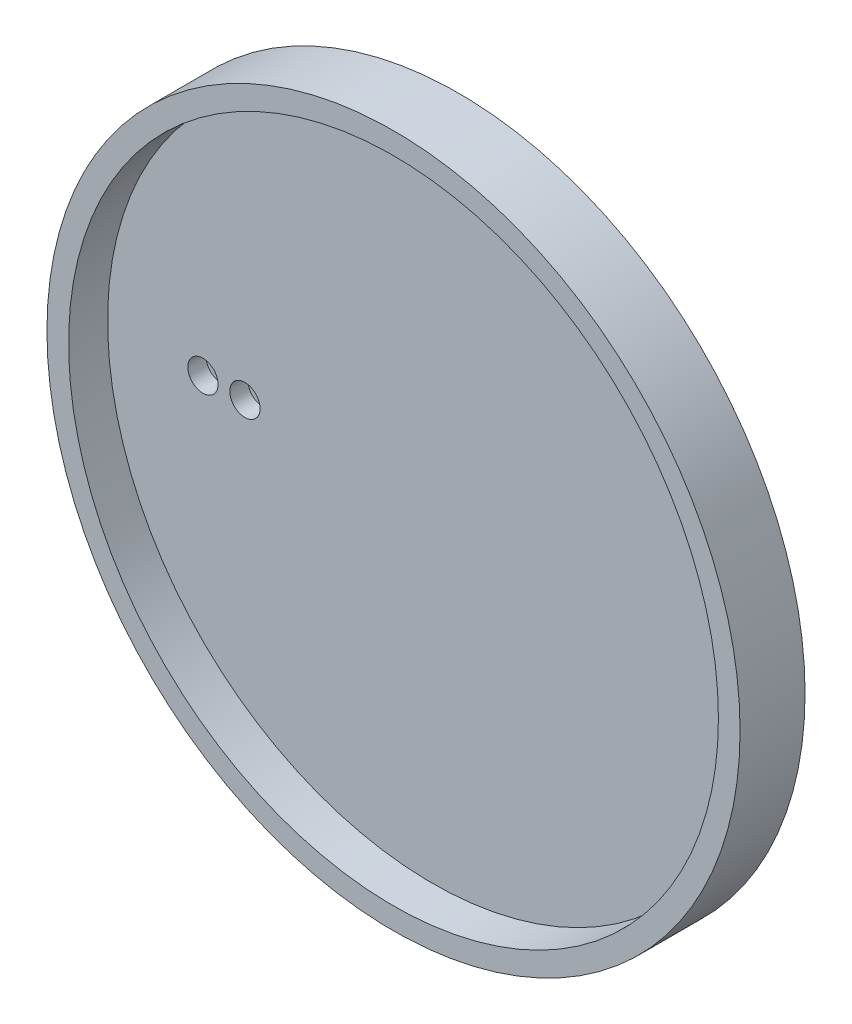
ISO-10303-21;
HEADER;
FILE_DESCRIPTION(('STEP AP214'),'2;1');
FILE_NAME('part.step','',(''),(''),'','','');
FILE_SCHEMA(('AUTOMOTIVE_DESIGN { 1 0 10303 214 1 1 1 1 }'));
ENDSEC;
DATA;
#1=APPLICATION_CONTEXT('core data for automotive mechanical design processes');
#2=APPLICATION_PROTOCOL_DEFINITION('international standard','automotive_design',2000,#1);
#3=PRODUCT_CONTEXT('',#1,'mechanical');
#4=PRODUCT('Part','Part','',(#3));
#5=PRODUCT_RELATED_PRODUCT_CATEGORY('part','',(#4));
#6=PRODUCT_DEFINITION_FORMATION('','',#4);
#7=PRODUCT_DEFINITION_CONTEXT('part definition',#1,'design');
#8=PRODUCT_DEFINITION('design','',#6,#7);
#9=PRODUCT_DEFINITION_SHAPE('','',#8);
#10=(LENGTH_UNIT() NAMED_UNIT(*) SI_UNIT(.MILLI.,.METRE.));
#11=(NAMED_UNIT(*) PLANE_ANGLE_UNIT() SI_UNIT($,.RADIAN.));
#12=(NAMED_UNIT(*) SI_UNIT($,.STERADIAN.) SOLID_ANGLE_UNIT());
#13=UNCERTAINTY_MEASURE_WITH_UNIT(LENGTH_MEASURE(1.E-05),#10,'distance_accuracy_value','');
#14=(GEOMETRIC_REPRESENTATION_CONTEXT(3) GLOBAL_UNCERTAINTY_ASSIGNED_CONTEXT((#13)) GLOBAL_UNIT_ASSIGNED_CONTEXT((#10,
#11,#12)) REPRESENTATION_CONTEXT('',''));
#15=CARTESIAN_POINT('',(0.,0.,0.));
#16=DIRECTION('',(0.,0.,1.));
#17=DIRECTION('',(1.,0.,0.));
#18=AXIS2_PLACEMENT_3D('',#15,#16,#17);
#19=CARTESIAN_POINT('',(-52.9937969924812,6.35,2.7));
#20=DIRECTION('',(0.,0.,-1.));
#21=DIRECTION('',(-1.,0.,0.));
#22=AXIS2_PLACEMENT_3D('',#19,#20,#21);
#23=CYLINDRICAL_SURFACE('',#22,2.04999999999999);
#24=CARTESIAN_POINT('',(-52.9937969924812,6.35,-10.));
#25=DIRECTION('',(0.,0.,-1.));
#26=DIRECTION('',(-1.,0.,0.));
#27=AXIS2_PLACEMENT_3D('',#24,#25,#26);
#28=CIRCLE('',#27,2.04999999999999);
#29=CARTESIAN_POINT('',(-55.0437969924812,6.35,-10.));
#30=VERTEX_POINT('',#29);
#31=EDGE_CURVE('E167',#30,#30,#28,.T.);
#32=ORIENTED_EDGE('',*,*,#31,.T.);
#33=EDGE_LOOP('',(#32));
#34=FACE_BOUND('',#33,.T.);
#35=CARTESIAN_POINT('',(-52.9937969924812,6.35,1.8));
#36=DIRECTION('',(0.,0.,1.));
#37=DIRECTION('',(1.,0.,0.));
#38=AXIS2_PLACEMENT_3D('',#35,#36,#37);
#39=CIRCLE('',#38,2.04999999999999);
#40=CARTESIAN_POINT('',(-50.9437969924812,6.35,1.8));
#41=VERTEX_POINT('',#40);
#42=EDGE_CURVE('E39',#41,#41,#39,.F.);
#43=ORIENTED_EDGE('',*,*,#42,.F.);
#44=EDGE_LOOP('',(#43));
#45=FACE_BOUND('',#44,.T.);
#46=ADVANCED_FACE('F35',(#34,#45),#23,.F.);
#47=CARTESIAN_POINT('',(-43.2937969924812,6.35,2.7));
#48=DIRECTION('',(0.,0.,-1.));
#49=DIRECTION('',(-1.,0.,0.));
#50=AXIS2_PLACEMENT_3D('',#47,#48,#49);
#51=CYLINDRICAL_SURFACE('',#50,2.04999999999999);
#52=CARTESIAN_POINT('',(-43.2937969924812,6.35,-10.));
#53=DIRECTION('',(0.,0.,-1.));
#54=DIRECTION('',(-1.,0.,0.));
#55=AXIS2_PLACEMENT_3D('',#52,#53,#54);
#56=CIRCLE('',#55,2.04999999999999);
#57=CARTESIAN_POINT('',(-45.3437969924812,6.35,-10.));
#58=VERTEX_POINT('',#57);
#59=EDGE_CURVE('E124',#58,#58,#56,.T.);
#60=ORIENTED_EDGE('',*,*,#59,.T.);
#61=EDGE_LOOP('',(#60));
#62=FACE_BOUND('',#61,.T.);
#63=CARTESIAN_POINT('',(-43.2937969924812,6.35,1.8));
#64=DIRECTION('',(0.,0.,1.));
#65=DIRECTION('',(1.,0.,0.));
#66=AXIS2_PLACEMENT_3D('',#63,#64,#65);
#67=CIRCLE('',#66,2.04999999999999);
#68=CARTESIAN_POINT('',(-41.2437969924812,6.35,1.8));
#69=VERTEX_POINT('',#68);
#70=EDGE_CURVE('E135',#69,#69,#67,.F.);
#71=ORIENTED_EDGE('',*,*,#70,.F.);
#72=EDGE_LOOP('',(#71));
#73=FACE_BOUND('',#72,.T.);
#74=ADVANCED_FACE('F203',(#62,#73),#51,.F.);
#75=CARTESIAN_POINT('',(-58.5761278195489,12.7,0.));
#76=DIRECTION('',(1.,0.,0.));
#77=DIRECTION('',(0.,0.,-1.));
#78=AXIS2_PLACEMENT_3D('',#75,#76,#77);
#79=PLANE('',#78);
#80=DIRECTION('',(0.,0.,1.));
#81=VECTOR('',#80,1.);
#82=CARTESIAN_POINT('',(-58.5761278195489,0.,0.));
#83=LINE('',#82,#81);
#84=CARTESIAN_POINT('',(-58.5761278195489,0.,-10.));
#85=VERTEX_POINT('',#84);
#86=CARTESIAN_POINT('',(-58.5761278195489,0.,0.));
#87=VERTEX_POINT('',#86);
#88=EDGE_CURVE('E120',#85,#87,#83,.T.);
#89=ORIENTED_EDGE('',*,*,#88,.T.);
#90=DIRECTION('',(0.,-1.,0.));
#91=VECTOR('',#90,1.);
#92=CARTESIAN_POINT('',(-58.5761278195489,12.7,0.));
#93=LINE('',#92,#91);
#94=CARTESIAN_POINT('',(-58.5761278195489,12.7,0.));
#95=VERTEX_POINT('',#94);
#96=EDGE_CURVE('E11',#95,#87,#93,.T.);
#97=ORIENTED_EDGE('',*,*,#96,.F.);
#98=DIRECTION('',(0.,0.,1.));
#99=VECTOR('',#98,1.);
#100=CARTESIAN_POINT('',(-58.5761278195489,12.7,0.));
#101=LINE('',#100,#99);
#102=CARTESIAN_POINT('',(-58.5761278195489,12.7,-10.));
#103=VERTEX_POINT('',#102);
#104=EDGE_CURVE('E87',#103,#95,#101,.T.);
#105=ORIENTED_EDGE('',*,*,#104,.F.);
#106=DIRECTION('',(0.,-1.,0.));
#107=VECTOR('',#106,1.);
#108=CARTESIAN_POINT('',(-58.5761278195489,12.7,-10.));
#109=LINE('',#108,#107);
#110=EDGE_CURVE('E116',#103,#85,#109,.T.);
#111=ORIENTED_EDGE('',*,*,#110,.T.);
#112=EDGE_LOOP('',(#89,#97,#105,#111));
#113=FACE_BOUND('',#112,.T.);
#114=ADVANCED_FACE('F37',(#113),#79,.F.);
#115=CARTESIAN_POINT('',(16.4238721804511,12.7,0.));
#116=DIRECTION('',(-1.,0.,0.));
#117=DIRECTION('',(0.,0.,1.));
#118=AXIS2_PLACEMENT_3D('',#115,#116,#117);
#119=PLANE('',#118);
#120=DIRECTION('',(0.,0.,-1.));
#121=VECTOR('',#120,1.);
#122=CARTESIAN_POINT('',(16.4238721804511,0.,0.));
#123=LINE('',#122,#121);
#124=CARTESIAN_POINT('',(16.4238721804511,0.,0.));
#125=VERTEX_POINT('',#124);
#126=CARTESIAN_POINT('',(16.4238721804511,0.,-5.));
#127=VERTEX_POINT('',#126);
#128=EDGE_CURVE('E127',#125,#127,#123,.T.);
#129=ORIENTED_EDGE('',*,*,#128,.T.);
#130=DIRECTION('',(0.,-1.,0.));
#131=VECTOR('',#130,1.);
#132=CARTESIAN_POINT('',(16.4238721804511,12.7,-5.));
#133=LINE('',#132,#131);
#134=CARTESIAN_POINT('',(16.4238721804511,12.7,-5.));
#135=VERTEX_POINT('',#134);
#136=EDGE_CURVE('E111',#135,#127,#133,.T.);
#137=ORIENTED_EDGE('',*,*,#136,.F.);
#138=DIRECTION('',(0.,0.,-1.));
#139=VECTOR('',#138,1.);
#140=CARTESIAN_POINT('',(16.4238721804511,12.7,0.));
#141=LINE('',#140,#139);
#142=CARTESIAN_POINT('',(16.4238721804511,12.7,0.));
#143=VERTEX_POINT('',#142);
#144=EDGE_CURVE('E102',#143,#135,#141,.T.);
#145=ORIENTED_EDGE('',*,*,#144,.F.);
#146=DIRECTION('',(0.,-1.,0.));
#147=VECTOR('',#146,1.);
#148=CARTESIAN_POINT('',(16.4238721804511,12.7,0.));
#149=LINE('',#148,#147);
#150=EDGE_CURVE('E45',#143,#125,#149,.T.);
#151=ORIENTED_EDGE('',*,*,#150,.T.);
#152=EDGE_LOOP('',(#129,#137,#145,#151));
#153=FACE_BOUND('',#152,.T.);
#154=ADVANCED_FACE('F178',(#153),#119,.F.);
#155=CARTESIAN_POINT('',(16.4238721804511,12.7,-5.));
#156=DIRECTION('',(0.,0.,1.));
#157=DIRECTION('',(1.,0.,0.));
#158=AXIS2_PLACEMENT_3D('',#155,#156,#157);
#159=PLANE('',#158);
#160=DIRECTION('',(-1.,0.,0.));
#161=VECTOR('',#160,1.);
#162=CARTESIAN_POINT('',(16.4238721804511,0.,-5.));
#163=LINE('',#162,#161);
#164=CARTESIAN_POINT('',(-37.7114661654135,0.,-4.99999999999999));
#165=VERTEX_POINT('',#164);
#166=EDGE_CURVE('E110',#127,#165,#163,.T.);
#167=ORIENTED_EDGE('',*,*,#166,.T.);
#168=DIRECTION('',(0.,-1.,0.));
#169=VECTOR('',#168,1.);
#170=CARTESIAN_POINT('',(-37.7114661654135,12.7,-4.99999999999999));
#171=LINE('',#170,#169);
#172=CARTESIAN_POINT('',(-37.7114661654135,12.7,-4.99999999999999));
#173=VERTEX_POINT('',#172);
#174=EDGE_CURVE('E107',#173,#165,#171,.T.);
#175=ORIENTED_EDGE('',*,*,#174,.F.);
#176=DIRECTION('',(-1.,0.,0.));
#177=VECTOR('',#176,1.);
#178=CARTESIAN_POINT('',(16.4238721804511,12.7,-5.));
#179=LINE('',#178,#177);
#180=EDGE_CURVE('E96',#135,#173,#179,.T.);
#181=ORIENTED_EDGE('',*,*,#180,.F.);
#182=ORIENTED_EDGE('',*,*,#136,.T.);
#183=EDGE_LOOP('',(#167,#175,#181,#182));
#184=FACE_BOUND('',#183,.T.);
#185=ADVANCED_FACE('F108',(#184),#159,.F.);
#186=CARTESIAN_POINT('',(-37.7114661654135,12.7,-4.99999999999999));
#187=DIRECTION('',(-1.,0.,0.));
#188=DIRECTION('',(0.,0.,1.));
#189=AXIS2_PLACEMENT_3D('',#186,#187,#188);
#190=PLANE('',#189);
#191=DIRECTION('',(0.,0.,-1.));
#192=VECTOR('',#191,1.);
#193=CARTESIAN_POINT('',(-37.7114661654135,0.,-4.99999999999999));
#194=LINE('',#193,#192);
#195=CARTESIAN_POINT('',(-37.7114661654135,0.,-10.));
#196=VERTEX_POINT('',#195);
#197=EDGE_CURVE('E75',#165,#196,#194,.T.);
#198=ORIENTED_EDGE('',*,*,#197,.T.);
#199=DIRECTION('',(0.,-1.,0.));
#200=VECTOR('',#199,1.);
#201=CARTESIAN_POINT('',(-37.7114661654135,12.7,-10.));
#202=LINE('',#201,#200);
#203=CARTESIAN_POINT('',(-37.7114661654135,12.7,-10.));
#204=VERTEX_POINT('',#203);
#205=EDGE_CURVE('E112',#204,#196,#202,.T.);
#206=ORIENTED_EDGE('',*,*,#205,.F.);
#207=DIRECTION('',(0.,0.,-1.));
#208=VECTOR('',#207,1.);
#209=CARTESIAN_POINT('',(-37.7114661654135,12.7,-4.99999999999999));
#210=LINE('',#209,#208);
#211=EDGE_CURVE('E100',#173,#204,#210,.T.);
#212=ORIENTED_EDGE('',*,*,#211,.F.);
#213=ORIENTED_EDGE('',*,*,#174,.T.);
#214=EDGE_LOOP('',(#198,#206,#212,#213));
#215=FACE_BOUND('',#214,.T.);
#216=ADVANCED_FACE('F114',(#215),#190,.F.);
#217=CARTESIAN_POINT('',(-58.5761278195489,12.7,-10.));
#218=DIRECTION('',(0.,0.,1.));
#219=DIRECTION('',(1.,0.,0.));
#220=AXIS2_PLACEMENT_3D('',#217,#218,#219);
#221=PLANE('',#220);
#222=ORIENTED_EDGE('',*,*,#59,.F.);
#223=EDGE_LOOP('',(#222));
#224=FACE_BOUND('',#223,.T.);
#225=ORIENTED_EDGE('',*,*,#31,.F.);
#226=EDGE_LOOP('',(#225));
#227=FACE_BOUND('',#226,.T.);
#228=DIRECTION('',(-1.,0.,0.));
#229=VECTOR('',#228,1.);
#230=CARTESIAN_POINT('',(-58.5761278195489,0.,-10.));
#231=LINE('',#230,#229);
#232=EDGE_CURVE('E81',#196,#85,#231,.T.);
#233=ORIENTED_EDGE('',*,*,#232,.T.);
#234=ORIENTED_EDGE('',*,*,#110,.F.);
#235=DIRECTION('',(-1.,0.,0.));
#236=VECTOR('',#235,1.);
#237=CARTESIAN_POINT('',(-58.5761278195489,12.7,-10.));
#238=LINE('',#237,#236);
#239=EDGE_CURVE('E54',#204,#103,#238,.T.);
#240=ORIENTED_EDGE('',*,*,#239,.F.);
#241=ORIENTED_EDGE('',*,*,#205,.T.);
#242=EDGE_LOOP('',(#233,#234,#240,#241));
#243=FACE_BOUND('',#242,.T.);
#244=ADVANCED_FACE('F187',(#224,#227,#243),#221,.F.);
#245=CARTESIAN_POINT('',(0.,12.7,0.));
#246=DIRECTION('',(0.,-1.,0.));
#247=DIRECTION('',(0.,0.,-1.));
#248=AXIS2_PLACEMENT_3D('',#245,#246,#247);
#249=PLANE('',#248);
#250=ORIENTED_EDGE('',*,*,#104,.T.);
#251=DIRECTION('',(1.,0.,0.));
#252=VECTOR('',#251,1.);
#253=CARTESIAN_POINT('',(-58.5761278195489,12.7,0.));
#254=LINE('',#253,#252);
#255=EDGE_CURVE('E173',#95,#143,#254,.T.);
#256=ORIENTED_EDGE('',*,*,#255,.T.);
#257=ORIENTED_EDGE('',*,*,#144,.T.);
#258=ORIENTED_EDGE('',*,*,#180,.T.);
#259=ORIENTED_EDGE('',*,*,#211,.T.);
#260=ORIENTED_EDGE('',*,*,#239,.T.);
#261=EDGE_LOOP('',(#250,#256,#257,#258,#259,#260));
#262=FACE_BOUND('',#261,.T.);
#263=ADVANCED_FACE('F98',(#262),#249,.F.);
#264=CARTESIAN_POINT('',(0.,0.,0.));
#265=DIRECTION('',(0.,-1.,0.));
#266=DIRECTION('',(0.,0.,-1.));
#267=AXIS2_PLACEMENT_3D('',#264,#265,#266);
#268=PLANE('',#267);
#269=ORIENTED_EDGE('',*,*,#88,.F.);
#270=ORIENTED_EDGE('',*,*,#232,.F.);
#271=ORIENTED_EDGE('',*,*,#197,.F.);
#272=ORIENTED_EDGE('',*,*,#166,.F.);
#273=ORIENTED_EDGE('',*,*,#128,.F.);
#274=DIRECTION('',(1.,0.,0.));
#275=VECTOR('',#274,1.);
#276=CARTESIAN_POINT('',(-58.5761278195489,0.,0.));
#277=LINE('',#276,#275);
#278=EDGE_CURVE('E123',#87,#125,#277,.T.);
#279=ORIENTED_EDGE('',*,*,#278,.F.);
#280=EDGE_LOOP('',(#269,#270,#271,#272,#273,#279));
#281=FACE_BOUND('',#280,.T.);
#282=ADVANCED_FACE('F185',(#281),#268,.T.);
#283=CARTESIAN_POINT('',(0.,0.,0.));
#284=DIRECTION('',(0.,0.,1.));
#285=DIRECTION('',(1.,0.,0.));
#286=AXIS2_PLACEMENT_3D('',#283,#284,#285);
#287=PLANE('',#286);
#288=ORIENTED_EDGE('',*,*,#96,.T.);
#289=ORIENTED_EDGE('',*,*,#278,.T.);
#290=ORIENTED_EDGE('',*,*,#150,.F.);
#291=ORIENTED_EDGE('',*,*,#255,.F.);
#292=EDGE_LOOP('',(#288,#289,#290,#291));
#293=FACE_BOUND('',#292,.T.);
#294=CARTESIAN_POINT('',(0.,6.35,0.));
#295=DIRECTION('',(0.,0.,1.));
#296=DIRECTION('',(1.,0.,0.));
#297=AXIS2_PLACEMENT_3D('',#294,#295,#296);
#298=CIRCLE('',#297,80.);
#299=CARTESIAN_POINT('',(80.,6.35,0.));
#300=VERTEX_POINT('',#299);
#301=EDGE_CURVE('E141',#300,#300,#298,.T.);
#302=ORIENTED_EDGE('',*,*,#301,.F.);
#303=EDGE_LOOP('',(#302));
#304=FACE_BOUND('',#303,.T.);
#305=ADVANCED_FACE('F180',(#293,#304),#287,.F.);
#306=CARTESIAN_POINT('',(0.,0.,6.));
#307=DIRECTION('',(0.,0.,1.));
#308=DIRECTION('',(1.,0.,0.));
#309=AXIS2_PLACEMENT_3D('',#306,#307,#308);
#310=PLANE('',#309);
#311=CARTESIAN_POINT('',(-52.9937969924812,6.35,6.));
#312=DIRECTION('',(0.,0.,1.));
#313=DIRECTION('',(1.,0.,0.));
#314=AXIS2_PLACEMENT_3D('',#311,#312,#313);
#315=CIRCLE('',#314,3.5);
#316=CARTESIAN_POINT('',(-49.4937969924812,6.35,6.));
#317=VERTEX_POINT('',#316);
#318=EDGE_CURVE('E143',#317,#317,#315,.T.);
#319=ORIENTED_EDGE('',*,*,#318,.F.);
#320=EDGE_LOOP('',(#319));
#321=FACE_BOUND('',#320,.T.);
#322=CARTESIAN_POINT('',(-43.2937969924812,6.35,6.));
#323=DIRECTION('',(0.,0.,1.));
#324=DIRECTION('',(1.,0.,0.));
#325=AXIS2_PLACEMENT_3D('',#322,#323,#324);
#326=CIRCLE('',#325,3.5);
#327=CARTESIAN_POINT('',(-39.7937969924812,6.35,6.));
#328=VERTEX_POINT('',#327);
#329=EDGE_CURVE('E153',#328,#328,#326,.T.);
#330=ORIENTED_EDGE('',*,*,#329,.F.);
#331=EDGE_LOOP('',(#330));
#332=FACE_BOUND('',#331,.T.);
#333=CARTESIAN_POINT('',(0.,6.35,6.));
#334=DIRECTION('',(0.,0.,1.));
#335=DIRECTION('',(1.,0.,0.));
#336=AXIS2_PLACEMENT_3D('',#333,#334,#335);
#337=CIRCLE('',#336,75.);
#338=CARTESIAN_POINT('',(75.,6.35,6.));
#339=VERTEX_POINT('',#338);
#340=EDGE_CURVE('E162',#339,#339,#337,.F.);
#341=ORIENTED_EDGE('',*,*,#340,.F.);
#342=EDGE_LOOP('',(#341));
#343=FACE_BOUND('',#342,.T.);
#344=ADVANCED_FACE('F218',(#321,#332,#343),#310,.T.);
#345=CARTESIAN_POINT('',(0.,6.35,15.));
#346=DIRECTION('',(0.,0.,-1.));
#347=DIRECTION('',(-1.,0.,0.));
#348=AXIS2_PLACEMENT_3D('',#345,#346,#347);
#349=CYLINDRICAL_SURFACE('',#348,75.);
#350=ORIENTED_EDGE('',*,*,#340,.T.);
#351=EDGE_LOOP('',(#350));
#352=FACE_BOUND('',#351,.T.);
#353=CARTESIAN_POINT('',(0.,6.35,15.));
#354=DIRECTION('',(0.,0.,1.));
#355=DIRECTION('',(1.,0.,0.));
#356=AXIS2_PLACEMENT_3D('',#353,#354,#355);
#357=CIRCLE('',#356,75.);
#358=CARTESIAN_POINT('',(75.,6.35,15.));
#359=VERTEX_POINT('',#358);
#360=EDGE_CURVE('E156',#359,#359,#357,.T.);
#361=ORIENTED_EDGE('',*,*,#360,.T.);
#362=EDGE_LOOP('',(#361));
#363=FACE_BOUND('',#362,.T.);
#364=ADVANCED_FACE('F221',(#352,#363),#349,.F.);
#365=CARTESIAN_POINT('',(0.,6.35,15.));
#366=DIRECTION('',(0.,0.,-1.));
#367=DIRECTION('',(-1.,0.,0.));
#368=AXIS2_PLACEMENT_3D('',#365,#366,#367);
#369=CYLINDRICAL_SURFACE('',#368,80.);
#370=CARTESIAN_POINT('',(0.,6.35,15.));
#371=DIRECTION('',(0.,0.,1.));
#372=DIRECTION('',(1.,0.,0.));
#373=AXIS2_PLACEMENT_3D('',#370,#371,#372);
#374=CIRCLE('',#373,80.);
#375=CARTESIAN_POINT('',(80.,6.35,15.));
#376=VERTEX_POINT('',#375);
#377=EDGE_CURVE('E159',#376,#376,#374,.T.);
#378=ORIENTED_EDGE('',*,*,#377,.F.);
#379=EDGE_LOOP('',(#378));
#380=FACE_BOUND('',#379,.T.);
#381=ORIENTED_EDGE('',*,*,#301,.T.);
#382=EDGE_LOOP('',(#381));
#383=FACE_BOUND('',#382,.T.);
#384=ADVANCED_FACE('F227',(#380,#383),#369,.T.);
#385=CARTESIAN_POINT('',(0.,0.,15.));
#386=DIRECTION('',(0.,0.,1.));
#387=DIRECTION('',(1.,0.,0.));
#388=AXIS2_PLACEMENT_3D('',#385,#386,#387);
#389=PLANE('',#388);
#390=ORIENTED_EDGE('',*,*,#360,.F.);
#391=EDGE_LOOP('',(#390));
#392=FACE_BOUND('',#391,.T.);
#393=ORIENTED_EDGE('',*,*,#377,.T.);
#394=EDGE_LOOP('',(#393));
#395=FACE_BOUND('',#394,.T.);
#396=ADVANCED_FACE('F231',(#392,#395),#389,.T.);
#397=CARTESIAN_POINT('',(-43.2937969924812,6.35,1.8));
#398=DIRECTION('',(0.,0.,1.));
#399=DIRECTION('',(1.,0.,0.));
#400=AXIS2_PLACEMENT_3D('',#397,#398,#399);
#401=PLANE('',#400);
#402=CARTESIAN_POINT('',(-43.2937969924812,6.35,1.8));
#403=DIRECTION('',(0.,0.,1.));
#404=DIRECTION('',(1.,0.,0.));
#405=AXIS2_PLACEMENT_3D('',#402,#403,#404);
#406=CIRCLE('',#405,3.5);
#407=CARTESIAN_POINT('',(-39.7937969924812,6.35,1.8));
#408=VERTEX_POINT('',#407);
#409=EDGE_CURVE('E148',#408,#408,#406,.T.);
#410=ORIENTED_EDGE('',*,*,#409,.T.);
#411=EDGE_LOOP('',(#410));
#412=FACE_BOUND('',#411,.T.);
#413=ORIENTED_EDGE('',*,*,#70,.T.);
#414=EDGE_LOOP('',(#413));
#415=FACE_BOUND('',#414,.T.);
#416=ADVANCED_FACE('F235',(#412,#415),#401,.T.);
#417=CARTESIAN_POINT('',(-43.2937969924812,6.35,1.8));
#418=DIRECTION('',(0.,0.,1.));
#419=DIRECTION('',(1.,0.,0.));
#420=AXIS2_PLACEMENT_3D('',#417,#418,#419);
#421=CYLINDRICAL_SURFACE('',#420,3.5);
#422=ORIENTED_EDGE('',*,*,#409,.F.);
#423=EDGE_LOOP('',(#422));
#424=FACE_BOUND('',#423,.T.);
#425=ORIENTED_EDGE('',*,*,#329,.T.);
#426=EDGE_LOOP('',(#425));
#427=FACE_BOUND('',#426,.T.);
#428=ADVANCED_FACE('F237',(#424,#427),#421,.F.);
#429=CARTESIAN_POINT('',(-52.9937969924812,6.35,1.8));
#430=DIRECTION('',(0.,0.,1.));
#431=DIRECTION('',(1.,0.,0.));
#432=AXIS2_PLACEMENT_3D('',#429,#430,#431);
#433=PLANE('',#432);
#434=CARTESIAN_POINT('',(-52.9937969924812,6.35,1.8));
#435=DIRECTION('',(0.,0.,1.));
#436=DIRECTION('',(1.,0.,0.));
#437=AXIS2_PLACEMENT_3D('',#434,#435,#436);
#438=CIRCLE('',#437,3.5);
#439=CARTESIAN_POINT('',(-49.4937969924812,6.35,1.8));
#440=VERTEX_POINT('',#439);
#441=EDGE_CURVE('E137',#440,#440,#438,.T.);
#442=ORIENTED_EDGE('',*,*,#441,.T.);
#443=EDGE_LOOP('',(#442));
#444=FACE_BOUND('',#443,.T.);
#445=ORIENTED_EDGE('',*,*,#42,.T.);
#446=EDGE_LOOP('',(#445));
#447=FACE_BOUND('',#446,.T.);
#448=ADVANCED_FACE('F240',(#444,#447),#433,.T.);
#449=CARTESIAN_POINT('',(-52.9937969924812,6.35,1.8));
#450=DIRECTION('',(0.,0.,1.));
#451=DIRECTION('',(1.,0.,0.));
#452=AXIS2_PLACEMENT_3D('',#449,#450,#451);
#453=CYLINDRICAL_SURFACE('',#452,3.5);
#454=ORIENTED_EDGE('',*,*,#441,.F.);
#455=EDGE_LOOP('',(#454));
#456=FACE_BOUND('',#455,.T.);
#457=ORIENTED_EDGE('',*,*,#318,.T.);
#458=EDGE_LOOP('',(#457));
#459=FACE_BOUND('',#458,.T.);
#460=ADVANCED_FACE('F245',(#456,#459),#453,.F.);
#461=CLOSED_SHELL('',(#46,#74,#114,#154,#185,#216,#244,#263,#282,#305,#344,#364,#384,#396,#416,
#428,#448,#460));
#462=MANIFOLD_SOLID_BREP('B2',#461);
#463=ADVANCED_BREP_SHAPE_REPRESENTATION('',(#18,#462),#14);
#464=SHAPE_DEFINITION_REPRESENTATION(#9,#463);
ENDSEC;
END-ISO-10303-21;
